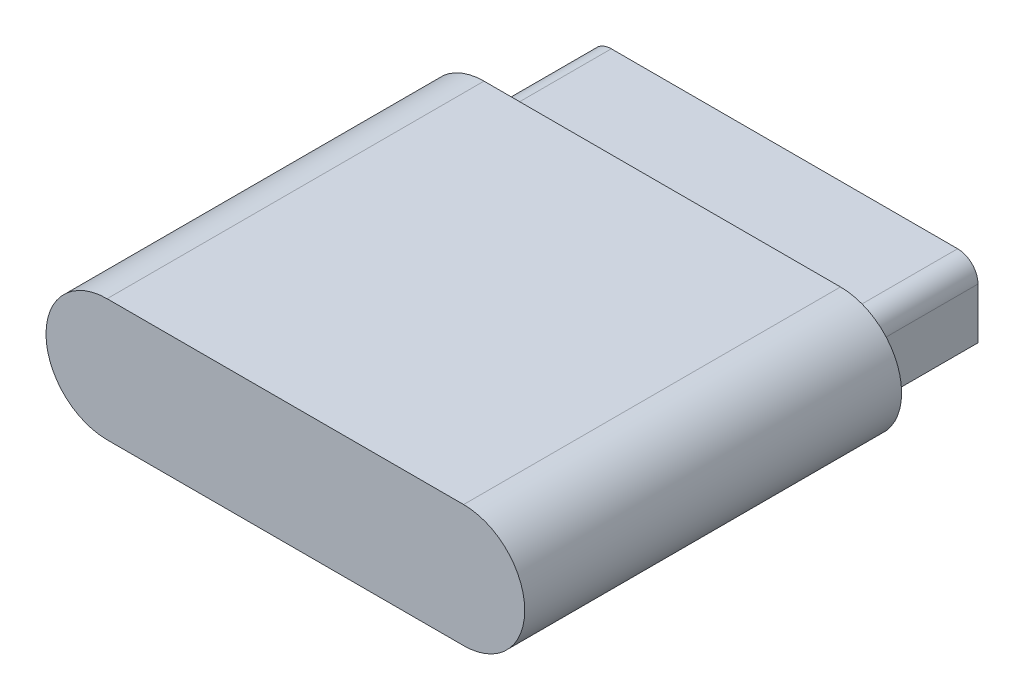
ISO-10303-21;
HEADER;
FILE_DESCRIPTION(('STEP AP214'),'2;1');
FILE_NAME('part.step','',(''),(''),'','','');
FILE_SCHEMA(('AUTOMOTIVE_DESIGN { 1 0 10303 214 1 1 1 1 }'));
ENDSEC;
DATA;
#1=APPLICATION_CONTEXT('core data for automotive mechanical design processes');
#2=APPLICATION_PROTOCOL_DEFINITION('international standard','automotive_design',2000,#1);
#3=PRODUCT_CONTEXT('',#1,'mechanical');
#4=PRODUCT('Part','Part','',(#3));
#5=PRODUCT_RELATED_PRODUCT_CATEGORY('part','',(#4));
#6=PRODUCT_DEFINITION_FORMATION('','',#4);
#7=PRODUCT_DEFINITION_CONTEXT('part definition',#1,'design');
#8=PRODUCT_DEFINITION('design','',#6,#7);
#9=PRODUCT_DEFINITION_SHAPE('','',#8);
#10=(LENGTH_UNIT() NAMED_UNIT(*) SI_UNIT(.MILLI.,.METRE.));
#11=(NAMED_UNIT(*) PLANE_ANGLE_UNIT() SI_UNIT($,.RADIAN.));
#12=(NAMED_UNIT(*) SI_UNIT($,.STERADIAN.) SOLID_ANGLE_UNIT());
#13=UNCERTAINTY_MEASURE_WITH_UNIT(LENGTH_MEASURE(1.E-05),#10,'distance_accuracy_value','');
#14=(GEOMETRIC_REPRESENTATION_CONTEXT(3) GLOBAL_UNCERTAINTY_ASSIGNED_CONTEXT((#13)) GLOBAL_UNIT_ASSIGNED_CONTEXT((#10,
#11,#12)) REPRESENTATION_CONTEXT('',''));
#15=CARTESIAN_POINT('',(0.,0.,0.));
#16=DIRECTION('',(0.,0.,1.));
#17=DIRECTION('',(1.,0.,0.));
#18=AXIS2_PLACEMENT_3D('',#15,#16,#17);
#19=CARTESIAN_POINT('',(41.,6.,-37.));
#20=DIRECTION('',(0.,0.,1.));
#21=DIRECTION('',(1.,0.,0.));
#22=AXIS2_PLACEMENT_3D('',#19,#20,#21);
#23=PLANE('',#22);
#24=CARTESIAN_POINT('',(41.,6.,-37.));
#25=DIRECTION('',(0.,0.,1.));
#26=DIRECTION('',(1.,0.,0.));
#27=AXIS2_PLACEMENT_3D('',#24,#25,#26);
#28=CIRCLE('',#27,6.);
#29=CARTESIAN_POINT('',(41.,0.,-37.));
#30=VERTEX_POINT('',#29);
#31=CARTESIAN_POINT('',(41.,12.,-37.));
#32=VERTEX_POINT('',#31);
#33=EDGE_CURVE('E143',#30,#32,#28,.T.);
#34=ORIENTED_EDGE('',*,*,#33,.F.);
#35=DIRECTION('',(1.,0.,0.));
#36=VECTOR('',#35,1.);
#37=CARTESIAN_POINT('',(6.,0.,-37.));
#38=LINE('',#37,#36);
#39=CARTESIAN_POINT('',(6.,0.,-37.));
#40=VERTEX_POINT('',#39);
#41=EDGE_CURVE('E153',#40,#30,#38,.T.);
#42=ORIENTED_EDGE('',*,*,#41,.F.);
#43=CARTESIAN_POINT('',(6.,6.,-37.));
#44=DIRECTION('',(0.,0.,1.));
#45=DIRECTION('',(1.,0.,0.));
#46=AXIS2_PLACEMENT_3D('',#43,#44,#45);
#47=CIRCLE('',#46,6.);
#48=CARTESIAN_POINT('',(6.,12.,-37.));
#49=VERTEX_POINT('',#48);
#50=EDGE_CURVE('E150',#49,#40,#47,.T.);
#51=ORIENTED_EDGE('',*,*,#50,.F.);
#52=DIRECTION('',(-1.,0.,0.));
#53=VECTOR('',#52,1.);
#54=CARTESIAN_POINT('',(6.,12.,-37.));
#55=LINE('',#54,#53);
#56=EDGE_CURVE('E146',#32,#49,#55,.T.);
#57=ORIENTED_EDGE('',*,*,#56,.F.);
#58=EDGE_LOOP('',(#34,#42,#51,#57));
#59=FACE_BOUND('',#58,.T.);
#60=DIRECTION('',(0.,-1.,0.));
#61=VECTOR('',#60,1.);
#62=CARTESIAN_POINT('',(42.5,7.,-37.));
#63=LINE('',#62,#61);
#64=CARTESIAN_POINT('',(42.5,7.,-37.));
#65=VERTEX_POINT('',#64);
#66=CARTESIAN_POINT('',(42.5,2.,-37.));
#67=VERTEX_POINT('',#66);
#68=EDGE_CURVE('E53',#65,#67,#63,.T.);
#69=ORIENTED_EDGE('',*,*,#68,.F.);
#70=CARTESIAN_POINT('',(40.5,7.,-37.));
#71=DIRECTION('',(0.,0.,-1.));
#72=DIRECTION('',(-1.,0.,0.));
#73=AXIS2_PLACEMENT_3D('',#70,#71,#72);
#74=CIRCLE('',#73,2.);
#75=CARTESIAN_POINT('',(40.5,9.,-37.));
#76=VERTEX_POINT('',#75);
#77=EDGE_CURVE('E57',#76,#65,#74,.T.);
#78=ORIENTED_EDGE('',*,*,#77,.F.);
#79=DIRECTION('',(1.,0.,0.));
#80=VECTOR('',#79,1.);
#81=CARTESIAN_POINT('',(6.5,9.,-37.));
#82=LINE('',#81,#80);
#83=CARTESIAN_POINT('',(6.5,9.,-37.));
#84=VERTEX_POINT('',#83);
#85=EDGE_CURVE('E296',#84,#76,#82,.T.);
#86=ORIENTED_EDGE('',*,*,#85,.F.);
#87=CARTESIAN_POINT('',(6.5,7.,-37.));
#88=DIRECTION('',(0.,0.,-1.));
#89=DIRECTION('',(-1.,0.,0.));
#90=AXIS2_PLACEMENT_3D('',#87,#88,#89);
#91=CIRCLE('',#90,2.);
#92=CARTESIAN_POINT('',(4.5,7.,-37.));
#93=VERTEX_POINT('',#92);
#94=EDGE_CURVE('E311',#93,#84,#91,.T.);
#95=ORIENTED_EDGE('',*,*,#94,.F.);
#96=DIRECTION('',(0.,1.,0.));
#97=VECTOR('',#96,1.);
#98=CARTESIAN_POINT('',(4.5,2.,-37.));
#99=LINE('',#98,#97);
#100=CARTESIAN_POINT('',(4.5,2.,-37.));
#101=VERTEX_POINT('',#100);
#102=EDGE_CURVE('E314',#101,#93,#99,.T.);
#103=ORIENTED_EDGE('',*,*,#102,.F.);
#104=DIRECTION('',(-1.,0.,0.));
#105=VECTOR('',#104,1.);
#106=CARTESIAN_POINT('',(42.5,2.,-37.));
#107=LINE('',#106,#105);
#108=EDGE_CURVE('E315',#67,#101,#107,.T.);
#109=ORIENTED_EDGE('',*,*,#108,.F.);
#110=EDGE_LOOP('',(#69,#78,#86,#95,#103,#109));
#111=FACE_BOUND('',#110,.T.);
#112=ADVANCED_FACE('F36',(#59,#111),#23,.F.);
#113=CARTESIAN_POINT('',(41.,6.,-37.));
#114=DIRECTION('',(0.,0.,1.));
#115=DIRECTION('',(1.,0.,0.));
#116=AXIS2_PLACEMENT_3D('',#113,#114,#115);
#117=CYLINDRICAL_SURFACE('',#116,6.);
#118=CARTESIAN_POINT('',(41.,6.,0.));
#119=DIRECTION('',(0.,0.,1.));
#120=DIRECTION('',(1.,0.,0.));
#121=AXIS2_PLACEMENT_3D('',#118,#119,#120);
#122=CIRCLE('',#121,6.);
#123=CARTESIAN_POINT('',(41.,0.,0.));
#124=VERTEX_POINT('',#123);
#125=CARTESIAN_POINT('',(41.,12.,0.));
#126=VERTEX_POINT('',#125);
#127=EDGE_CURVE('E134',#124,#126,#122,.T.);
#128=ORIENTED_EDGE('',*,*,#127,.F.);
#129=DIRECTION('',(0.,0.,1.));
#130=VECTOR('',#129,1.);
#131=CARTESIAN_POINT('',(41.,0.,-37.));
#132=LINE('',#131,#130);
#133=EDGE_CURVE('E11',#30,#124,#132,.T.);
#134=ORIENTED_EDGE('',*,*,#133,.F.);
#135=ORIENTED_EDGE('',*,*,#33,.T.);
#136=DIRECTION('',(0.,0.,1.));
#137=VECTOR('',#136,1.);
#138=CARTESIAN_POINT('',(41.,12.,-37.));
#139=LINE('',#138,#137);
#140=EDGE_CURVE('E40',#32,#126,#139,.T.);
#141=ORIENTED_EDGE('',*,*,#140,.T.);
#142=EDGE_LOOP('',(#128,#134,#135,#141));
#143=FACE_BOUND('',#142,.T.);
#144=ADVANCED_FACE('F38',(#143),#117,.T.);
#145=CARTESIAN_POINT('',(6.,0.,-37.));
#146=DIRECTION('',(0.,-1.,0.));
#147=DIRECTION('',(0.,0.,-1.));
#148=AXIS2_PLACEMENT_3D('',#145,#146,#147);
#149=PLANE('',#148);
#150=DIRECTION('',(1.,0.,0.));
#151=VECTOR('',#150,1.);
#152=CARTESIAN_POINT('',(6.,0.,0.));
#153=LINE('',#152,#151);
#154=CARTESIAN_POINT('',(6.,0.,0.));
#155=VERTEX_POINT('',#154);
#156=EDGE_CURVE('E147',#155,#124,#153,.T.);
#157=ORIENTED_EDGE('',*,*,#156,.F.);
#158=DIRECTION('',(0.,0.,1.));
#159=VECTOR('',#158,1.);
#160=CARTESIAN_POINT('',(6.,0.,-37.));
#161=LINE('',#160,#159);
#162=EDGE_CURVE('E45',#40,#155,#161,.T.);
#163=ORIENTED_EDGE('',*,*,#162,.F.);
#164=ORIENTED_EDGE('',*,*,#41,.T.);
#165=ORIENTED_EDGE('',*,*,#133,.T.);
#166=EDGE_LOOP('',(#157,#163,#164,#165));
#167=FACE_BOUND('',#166,.T.);
#168=ADVANCED_FACE('F176',(#167),#149,.T.);
#169=CARTESIAN_POINT('',(6.,6.,-37.));
#170=DIRECTION('',(0.,0.,1.));
#171=DIRECTION('',(1.,0.,0.));
#172=AXIS2_PLACEMENT_3D('',#169,#170,#171);
#173=CYLINDRICAL_SURFACE('',#172,6.);
#174=CARTESIAN_POINT('',(6.,6.,0.));
#175=DIRECTION('',(0.,0.,1.));
#176=DIRECTION('',(1.,0.,0.));
#177=AXIS2_PLACEMENT_3D('',#174,#175,#176);
#178=CIRCLE('',#177,6.);
#179=CARTESIAN_POINT('',(6.,12.,0.));
#180=VERTEX_POINT('',#179);
#181=EDGE_CURVE('E158',#180,#155,#178,.T.);
#182=ORIENTED_EDGE('',*,*,#181,.F.);
#183=DIRECTION('',(0.,0.,1.));
#184=VECTOR('',#183,1.);
#185=CARTESIAN_POINT('',(6.,12.,-37.));
#186=LINE('',#185,#184);
#187=EDGE_CURVE('E163',#49,#180,#186,.T.);
#188=ORIENTED_EDGE('',*,*,#187,.F.);
#189=ORIENTED_EDGE('',*,*,#50,.T.);
#190=ORIENTED_EDGE('',*,*,#162,.T.);
#191=EDGE_LOOP('',(#182,#188,#189,#190));
#192=FACE_BOUND('',#191,.T.);
#193=ADVANCED_FACE('F181',(#192),#173,.T.);
#194=CARTESIAN_POINT('',(6.,12.,-37.));
#195=DIRECTION('',(0.,1.,0.));
#196=DIRECTION('',(0.,0.,1.));
#197=AXIS2_PLACEMENT_3D('',#194,#195,#196);
#198=PLANE('',#197);
#199=DIRECTION('',(-1.,0.,0.));
#200=VECTOR('',#199,1.);
#201=CARTESIAN_POINT('',(6.,12.,0.));
#202=LINE('',#201,#200);
#203=EDGE_CURVE('E137',#126,#180,#202,.T.);
#204=ORIENTED_EDGE('',*,*,#203,.F.);
#205=ORIENTED_EDGE('',*,*,#140,.F.);
#206=ORIENTED_EDGE('',*,*,#56,.T.);
#207=ORIENTED_EDGE('',*,*,#187,.T.);
#208=EDGE_LOOP('',(#204,#205,#206,#207));
#209=FACE_BOUND('',#208,.T.);
#210=ADVANCED_FACE('F171',(#209),#198,.T.);
#211=CARTESIAN_POINT('',(41.,6.,0.));
#212=DIRECTION('',(0.,0.,1.));
#213=DIRECTION('',(1.,0.,0.));
#214=AXIS2_PLACEMENT_3D('',#211,#212,#213);
#215=PLANE('',#214);
#216=ORIENTED_EDGE('',*,*,#127,.T.);
#217=ORIENTED_EDGE('',*,*,#203,.T.);
#218=ORIENTED_EDGE('',*,*,#181,.T.);
#219=ORIENTED_EDGE('',*,*,#156,.T.);
#220=EDGE_LOOP('',(#216,#217,#218,#219));
#221=FACE_BOUND('',#220,.T.);
#222=ADVANCED_FACE('F173',(#221),#215,.T.);
#223=CARTESIAN_POINT('',(42.5,7.,-49.));
#224=DIRECTION('',(-1.,0.,0.));
#225=DIRECTION('',(0.,0.,1.));
#226=AXIS2_PLACEMENT_3D('',#223,#224,#225);
#227=PLANE('',#226);
#228=ORIENTED_EDGE('',*,*,#68,.T.);
#229=DIRECTION('',(0.,0.,1.));
#230=VECTOR('',#229,1.);
#231=CARTESIAN_POINT('',(42.5,2.,-49.));
#232=LINE('',#231,#230);
#233=CARTESIAN_POINT('',(42.5,2.,-49.));
#234=VERTEX_POINT('',#233);
#235=EDGE_CURVE('E117',#234,#67,#232,.T.);
#236=ORIENTED_EDGE('',*,*,#235,.F.);
#237=DIRECTION('',(0.,-1.,0.));
#238=VECTOR('',#237,1.);
#239=CARTESIAN_POINT('',(42.5,7.,-49.));
#240=LINE('',#239,#238);
#241=CARTESIAN_POINT('',(42.5,7.,-49.));
#242=VERTEX_POINT('',#241);
#243=EDGE_CURVE('E123',#242,#234,#240,.T.);
#244=ORIENTED_EDGE('',*,*,#243,.F.);
#245=DIRECTION('',(0.,0.,1.));
#246=VECTOR('',#245,1.);
#247=CARTESIAN_POINT('',(42.5,7.,-49.));
#248=LINE('',#247,#246);
#249=EDGE_CURVE('E293',#242,#65,#248,.T.);
#250=ORIENTED_EDGE('',*,*,#249,.T.);
#251=EDGE_LOOP('',(#228,#236,#244,#250));
#252=FACE_BOUND('',#251,.T.);
#253=ADVANCED_FACE('F133',(#252),#227,.F.);
#254=CARTESIAN_POINT('',(42.5,2.,-49.));
#255=DIRECTION('',(0.,1.,0.));
#256=DIRECTION('',(-1.,0.,0.));
#257=AXIS2_PLACEMENT_3D('',#254,#255,#256);
#258=PLANE('',#257);
#259=ORIENTED_EDGE('',*,*,#108,.T.);
#260=DIRECTION('',(0.,0.,1.));
#261=VECTOR('',#260,1.);
#262=CARTESIAN_POINT('',(4.5,2.,-49.));
#263=LINE('',#262,#261);
#264=CARTESIAN_POINT('',(4.5,2.,-49.));
#265=VERTEX_POINT('',#264);
#266=EDGE_CURVE('E119',#265,#101,#263,.T.);
#267=ORIENTED_EDGE('',*,*,#266,.F.);
#268=DIRECTION('',(-1.,0.,0.));
#269=VECTOR('',#268,1.);
#270=CARTESIAN_POINT('',(42.5,2.,-49.));
#271=LINE('',#270,#269);
#272=EDGE_CURVE('E112',#234,#265,#271,.T.);
#273=ORIENTED_EDGE('',*,*,#272,.F.);
#274=ORIENTED_EDGE('',*,*,#235,.T.);
#275=EDGE_LOOP('',(#259,#267,#273,#274));
#276=FACE_BOUND('',#275,.T.);
#277=ADVANCED_FACE('F115',(#276),#258,.F.);
#278=CARTESIAN_POINT('',(4.5,2.,-49.));
#279=DIRECTION('',(1.,0.,0.));
#280=DIRECTION('',(0.,0.,-1.));
#281=AXIS2_PLACEMENT_3D('',#278,#279,#280);
#282=PLANE('',#281);
#283=ORIENTED_EDGE('',*,*,#102,.T.);
#284=DIRECTION('',(0.,0.,1.));
#285=VECTOR('',#284,1.);
#286=CARTESIAN_POINT('',(4.5,7.,-49.));
#287=LINE('',#286,#285);
#288=CARTESIAN_POINT('',(4.5,7.,-49.));
#289=VERTEX_POINT('',#288);
#290=EDGE_CURVE('E139',#289,#93,#287,.T.);
#291=ORIENTED_EDGE('',*,*,#290,.F.);
#292=DIRECTION('',(0.,1.,0.));
#293=VECTOR('',#292,1.);
#294=CARTESIAN_POINT('',(4.5,2.,-49.));
#295=LINE('',#294,#293);
#296=EDGE_CURVE('E122',#265,#289,#295,.T.);
#297=ORIENTED_EDGE('',*,*,#296,.F.);
#298=ORIENTED_EDGE('',*,*,#266,.T.);
#299=EDGE_LOOP('',(#283,#291,#297,#298));
#300=FACE_BOUND('',#299,.T.);
#301=ADVANCED_FACE('F204',(#300),#282,.F.);
#302=CARTESIAN_POINT('',(6.5,7.,-49.));
#303=DIRECTION('',(0.,0.,1.));
#304=DIRECTION('',(1.,0.,0.));
#305=AXIS2_PLACEMENT_3D('',#302,#303,#304);
#306=CYLINDRICAL_SURFACE('',#305,2.);
#307=ORIENTED_EDGE('',*,*,#94,.T.);
#308=DIRECTION('',(0.,0.,1.));
#309=VECTOR('',#308,1.);
#310=CARTESIAN_POINT('',(6.5,9.,-49.));
#311=LINE('',#310,#309);
#312=CARTESIAN_POINT('',(6.5,9.,-49.));
#313=VERTEX_POINT('',#312);
#314=EDGE_CURVE('E299',#313,#84,#311,.T.);
#315=ORIENTED_EDGE('',*,*,#314,.F.);
#316=CARTESIAN_POINT('',(6.5,7.,-49.));
#317=DIRECTION('',(0.,0.,-1.));
#318=DIRECTION('',(-1.,0.,0.));
#319=AXIS2_PLACEMENT_3D('',#316,#317,#318);
#320=CIRCLE('',#319,2.);
#321=EDGE_CURVE('E312',#289,#313,#320,.T.);
#322=ORIENTED_EDGE('',*,*,#321,.F.);
#323=ORIENTED_EDGE('',*,*,#290,.T.);
#324=EDGE_LOOP('',(#307,#315,#322,#323));
#325=FACE_BOUND('',#324,.T.);
#326=ADVANCED_FACE('F208',(#325),#306,.T.);
#327=CARTESIAN_POINT('',(6.5,9.,-49.));
#328=DIRECTION('',(0.,-1.,0.));
#329=DIRECTION('',(1.,0.,0.));
#330=AXIS2_PLACEMENT_3D('',#327,#328,#329);
#331=PLANE('',#330);
#332=ORIENTED_EDGE('',*,*,#85,.T.);
#333=DIRECTION('',(0.,0.,1.));
#334=VECTOR('',#333,1.);
#335=CARTESIAN_POINT('',(40.5,9.,-49.));
#336=LINE('',#335,#334);
#337=CARTESIAN_POINT('',(40.5,9.,-49.));
#338=VERTEX_POINT('',#337);
#339=EDGE_CURVE('E295',#338,#76,#336,.T.);
#340=ORIENTED_EDGE('',*,*,#339,.F.);
#341=DIRECTION('',(1.,0.,0.));
#342=VECTOR('',#341,1.);
#343=CARTESIAN_POINT('',(6.5,9.,-49.));
#344=LINE('',#343,#342);
#345=EDGE_CURVE('E301',#313,#338,#344,.T.);
#346=ORIENTED_EDGE('',*,*,#345,.F.);
#347=ORIENTED_EDGE('',*,*,#314,.T.);
#348=EDGE_LOOP('',(#332,#340,#346,#347));
#349=FACE_BOUND('',#348,.T.);
#350=ADVANCED_FACE('F214',(#349),#331,.F.);
#351=CARTESIAN_POINT('',(40.5,7.,-49.));
#352=DIRECTION('',(0.,0.,1.));
#353=DIRECTION('',(1.,0.,0.));
#354=AXIS2_PLACEMENT_3D('',#351,#352,#353);
#355=CYLINDRICAL_SURFACE('',#354,2.);
#356=ORIENTED_EDGE('',*,*,#77,.T.);
#357=ORIENTED_EDGE('',*,*,#249,.F.);
#358=CARTESIAN_POINT('',(40.5,7.,-49.));
#359=DIRECTION('',(0.,0.,-1.));
#360=DIRECTION('',(-1.,0.,0.));
#361=AXIS2_PLACEMENT_3D('',#358,#359,#360);
#362=CIRCLE('',#361,2.);
#363=EDGE_CURVE('E128',#338,#242,#362,.T.);
#364=ORIENTED_EDGE('',*,*,#363,.F.);
#365=ORIENTED_EDGE('',*,*,#339,.T.);
#366=EDGE_LOOP('',(#356,#357,#364,#365));
#367=FACE_BOUND('',#366,.T.);
#368=ADVANCED_FACE('F218',(#367),#355,.T.);
#369=CARTESIAN_POINT('',(6.5,7.,-49.));
#370=DIRECTION('',(0.,0.,-1.));
#371=DIRECTION('',(-1.,0.,0.));
#372=AXIS2_PLACEMENT_3D('',#369,#370,#371);
#373=PLANE('',#372);
#374=ORIENTED_EDGE('',*,*,#243,.T.);
#375=ORIENTED_EDGE('',*,*,#272,.T.);
#376=ORIENTED_EDGE('',*,*,#296,.T.);
#377=ORIENTED_EDGE('',*,*,#321,.T.);
#378=ORIENTED_EDGE('',*,*,#345,.T.);
#379=ORIENTED_EDGE('',*,*,#363,.T.);
#380=EDGE_LOOP('',(#374,#375,#376,#377,#378,#379));
#381=FACE_BOUND('',#380,.T.);
#382=ADVANCED_FACE('F126',(#381),#373,.T.);
#383=CLOSED_SHELL('',(#112,#144,#168,#193,#210,#222,#253,#277,#301,#326,#350,#368,#382));
#384=MANIFOLD_SOLID_BREP('B2',#383);
#385=ADVANCED_BREP_SHAPE_REPRESENTATION('',(#18,#384),#14);
#386=SHAPE_DEFINITION_REPRESENTATION(#9,#385);
ENDSEC;
END-ISO-10303-21;
